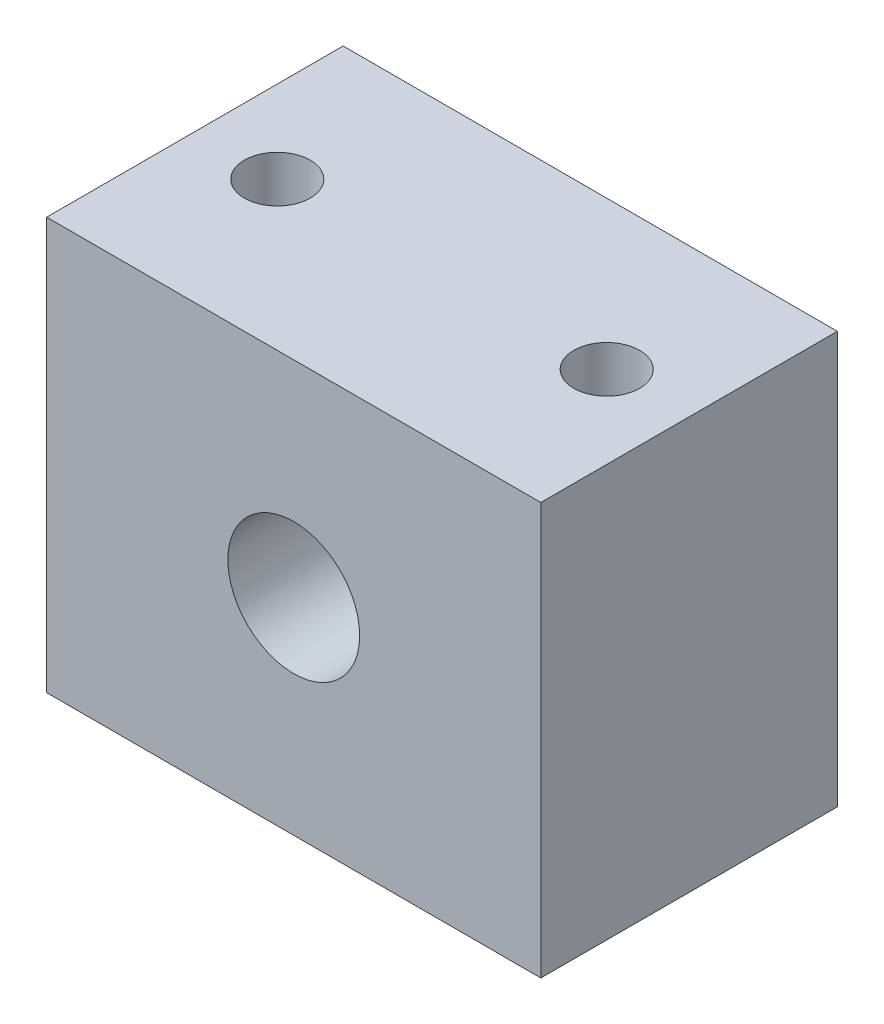
ISO-10303-21;
HEADER;
FILE_DESCRIPTION(('STEP AP214'),'2;1');
FILE_NAME('part.step','',(''),(''),'','','');
FILE_SCHEMA(('AUTOMOTIVE_DESIGN { 1 0 10303 214 1 1 1 1 }'));
ENDSEC;
DATA;
#1=APPLICATION_CONTEXT('core data for automotive mechanical design processes');
#2=APPLICATION_PROTOCOL_DEFINITION('international standard','automotive_design',2000,#1);
#3=PRODUCT_CONTEXT('',#1,'mechanical');
#4=PRODUCT('Part','Part','',(#3));
#5=PRODUCT_RELATED_PRODUCT_CATEGORY('part','',(#4));
#6=PRODUCT_DEFINITION_FORMATION('','',#4);
#7=PRODUCT_DEFINITION_CONTEXT('part definition',#1,'design');
#8=PRODUCT_DEFINITION('design','',#6,#7);
#9=PRODUCT_DEFINITION_SHAPE('','',#8);
#10=(LENGTH_UNIT() NAMED_UNIT(*) SI_UNIT(.MILLI.,.METRE.));
#11=(NAMED_UNIT(*) PLANE_ANGLE_UNIT() SI_UNIT($,.RADIAN.));
#12=(NAMED_UNIT(*) SI_UNIT($,.STERADIAN.) SOLID_ANGLE_UNIT());
#13=UNCERTAINTY_MEASURE_WITH_UNIT(LENGTH_MEASURE(1.E-05),#10,'distance_accuracy_value','');
#14=(GEOMETRIC_REPRESENTATION_CONTEXT(3) GLOBAL_UNCERTAINTY_ASSIGNED_CONTEXT((#13)) GLOBAL_UNIT_ASSIGNED_CONTEXT((#10,
#11,#12)) REPRESENTATION_CONTEXT('',''));
#15=CARTESIAN_POINT('',(0.,0.,0.));
#16=DIRECTION('',(0.,0.,1.));
#17=DIRECTION('',(1.,0.,0.));
#18=AXIS2_PLACEMENT_3D('',#15,#16,#17);
#19=CARTESIAN_POINT('',(0.,0.,18.));
#20=DIRECTION('',(0.,0.,1.));
#21=DIRECTION('',(1.,0.,0.));
#22=AXIS2_PLACEMENT_3D('',#19,#20,#21);
#23=PLANE('',#22);
#24=DIRECTION('',(0.,1.,0.));
#25=VECTOR('',#24,1.);
#26=CARTESIAN_POINT('',(15.,12.5,18.));
#27=LINE('',#26,#25);
#28=CARTESIAN_POINT('',(15.,-12.5,18.));
#29=VERTEX_POINT('',#28);
#30=CARTESIAN_POINT('',(15.,12.5,18.));
#31=VERTEX_POINT('',#30);
#32=EDGE_CURVE('E85',#29,#31,#27,.T.);
#33=ORIENTED_EDGE('',*,*,#32,.T.);
#34=DIRECTION('',(-1.,0.,0.));
#35=VECTOR('',#34,1.);
#36=CARTESIAN_POINT('',(-15.,12.5,18.));
#37=LINE('',#36,#35);
#38=CARTESIAN_POINT('',(-15.,12.5,18.));
#39=VERTEX_POINT('',#38);
#40=EDGE_CURVE('E80',#31,#39,#37,.T.);
#41=ORIENTED_EDGE('',*,*,#40,.T.);
#42=DIRECTION('',(0.,-1.,0.));
#43=VECTOR('',#42,1.);
#44=CARTESIAN_POINT('',(-15.,12.5,18.));
#45=LINE('',#44,#43);
#46=CARTESIAN_POINT('',(-15.,-12.5,18.));
#47=VERTEX_POINT('',#46);
#48=EDGE_CURVE('E83',#39,#47,#45,.T.);
#49=ORIENTED_EDGE('',*,*,#48,.T.);
#50=DIRECTION('',(1.,0.,0.));
#51=VECTOR('',#50,1.);
#52=CARTESIAN_POINT('',(-15.,-12.5,18.));
#53=LINE('',#52,#51);
#54=EDGE_CURVE('E50',#47,#29,#53,.T.);
#55=ORIENTED_EDGE('',*,*,#54,.T.);
#56=EDGE_LOOP('',(#33,#41,#49,#55));
#57=FACE_BOUND('',#56,.T.);
#58=CARTESIAN_POINT('',(0.,0.,18.));
#59=DIRECTION('',(0.,0.,1.));
#60=DIRECTION('',(1.,0.,0.));
#61=AXIS2_PLACEMENT_3D('',#58,#59,#60);
#62=CIRCLE('',#61,4.);
#63=CARTESIAN_POINT('',(4.,0.,18.));
#64=VERTEX_POINT('',#63);
#65=EDGE_CURVE('E100',#64,#64,#62,.T.);
#66=ORIENTED_EDGE('',*,*,#65,.F.);
#67=EDGE_LOOP('',(#66));
#68=FACE_BOUND('',#67,.T.);
#69=ADVANCED_FACE('F33',(#57,#68),#23,.T.);
#70=CARTESIAN_POINT('',(0.,0.,0.));
#71=DIRECTION('',(0.,0.,1.));
#72=DIRECTION('',(1.,0.,0.));
#73=AXIS2_PLACEMENT_3D('',#70,#71,#72);
#74=PLANE('',#73);
#75=DIRECTION('',(0.,1.,0.));
#76=VECTOR('',#75,1.);
#77=CARTESIAN_POINT('',(15.,12.5,0.));
#78=LINE('',#77,#76);
#79=CARTESIAN_POINT('',(15.,-12.5,0.));
#80=VERTEX_POINT('',#79);
#81=CARTESIAN_POINT('',(15.,12.5,0.));
#82=VERTEX_POINT('',#81);
#83=EDGE_CURVE('E97',#80,#82,#78,.T.);
#84=ORIENTED_EDGE('',*,*,#83,.F.);
#85=DIRECTION('',(1.,0.,0.));
#86=VECTOR('',#85,1.);
#87=CARTESIAN_POINT('',(-15.,-12.5,0.));
#88=LINE('',#87,#86);
#89=CARTESIAN_POINT('',(-15.,-12.5,0.));
#90=VERTEX_POINT('',#89);
#91=EDGE_CURVE('E73',#90,#80,#88,.T.);
#92=ORIENTED_EDGE('',*,*,#91,.F.);
#93=DIRECTION('',(0.,-1.,0.));
#94=VECTOR('',#93,1.);
#95=CARTESIAN_POINT('',(-15.,12.5,0.));
#96=LINE('',#95,#94);
#97=CARTESIAN_POINT('',(-15.,12.5,0.));
#98=VERTEX_POINT('',#97);
#99=EDGE_CURVE('E67',#98,#90,#96,.T.);
#100=ORIENTED_EDGE('',*,*,#99,.F.);
#101=DIRECTION('',(-1.,0.,0.));
#102=VECTOR('',#101,1.);
#103=CARTESIAN_POINT('',(-15.,12.5,0.));
#104=LINE('',#103,#102);
#105=EDGE_CURVE('E89',#82,#98,#104,.T.);
#106=ORIENTED_EDGE('',*,*,#105,.F.);
#107=EDGE_LOOP('',(#84,#92,#100,#106));
#108=FACE_BOUND('',#107,.T.);
#109=CARTESIAN_POINT('',(0.,0.,0.));
#110=DIRECTION('',(0.,0.,1.));
#111=DIRECTION('',(1.,0.,0.));
#112=AXIS2_PLACEMENT_3D('',#109,#110,#111);
#113=CIRCLE('',#112,4.);
#114=CARTESIAN_POINT('',(4.,0.,0.));
#115=VERTEX_POINT('',#114);
#116=EDGE_CURVE('E112',#115,#115,#113,.T.);
#117=ORIENTED_EDGE('',*,*,#116,.T.);
#118=EDGE_LOOP('',(#117));
#119=FACE_BOUND('',#118,.T.);
#120=ADVANCED_FACE('F108',(#108,#119),#74,.F.);
#121=CARTESIAN_POINT('',(15.,12.5,18.));
#122=DIRECTION('',(-1.,0.,0.));
#123=DIRECTION('',(0.,-1.,0.));
#124=AXIS2_PLACEMENT_3D('',#121,#122,#123);
#125=PLANE('',#124);
#126=ORIENTED_EDGE('',*,*,#83,.T.);
#127=DIRECTION('',(0.,0.,-1.));
#128=VECTOR('',#127,1.);
#129=CARTESIAN_POINT('',(15.,12.5,18.));
#130=LINE('',#129,#128);
#131=EDGE_CURVE('E11',#31,#82,#130,.T.);
#132=ORIENTED_EDGE('',*,*,#131,.F.);
#133=ORIENTED_EDGE('',*,*,#32,.F.);
#134=DIRECTION('',(0.,0.,-1.));
#135=VECTOR('',#134,1.);
#136=CARTESIAN_POINT('',(15.,-12.5,18.));
#137=LINE('',#136,#135);
#138=EDGE_CURVE('E93',#29,#80,#137,.T.);
#139=ORIENTED_EDGE('',*,*,#138,.T.);
#140=EDGE_LOOP('',(#126,#132,#133,#139));
#141=FACE_BOUND('',#140,.T.);
#142=ADVANCED_FACE('F35',(#141),#125,.F.);
#143=CARTESIAN_POINT('',(-15.,12.5,18.));
#144=DIRECTION('',(0.,-1.,0.));
#145=DIRECTION('',(0.,0.,-1.));
#146=AXIS2_PLACEMENT_3D('',#143,#144,#145);
#147=PLANE('',#146);
#148=CARTESIAN_POINT('',(-10.,12.5,9.));
#149=DIRECTION('',(0.,1.,0.));
#150=DIRECTION('',(0.,0.,1.));
#151=AXIS2_PLACEMENT_3D('',#148,#149,#150);
#152=CIRCLE('',#151,2.);
#153=CARTESIAN_POINT('',(-10.,12.5,11.));
#154=VERTEX_POINT('',#153);
#155=EDGE_CURVE('E124',#154,#154,#152,.T.);
#156=ORIENTED_EDGE('',*,*,#155,.F.);
#157=EDGE_LOOP('',(#156));
#158=FACE_BOUND('',#157,.T.);
#159=CARTESIAN_POINT('',(10.,12.5,9.));
#160=DIRECTION('',(0.,1.,0.));
#161=DIRECTION('',(0.,0.,-1.));
#162=AXIS2_PLACEMENT_3D('',#159,#160,#161);
#163=CIRCLE('',#162,2.);
#164=CARTESIAN_POINT('',(10.,12.5,7.));
#165=VERTEX_POINT('',#164);
#166=EDGE_CURVE('E118',#165,#165,#163,.T.);
#167=ORIENTED_EDGE('',*,*,#166,.F.);
#168=EDGE_LOOP('',(#167));
#169=FACE_BOUND('',#168,.T.);
#170=ORIENTED_EDGE('',*,*,#105,.T.);
#171=DIRECTION('',(0.,0.,-1.));
#172=VECTOR('',#171,1.);
#173=CARTESIAN_POINT('',(-15.,12.5,18.));
#174=LINE('',#173,#172);
#175=EDGE_CURVE('E42',#39,#98,#174,.T.);
#176=ORIENTED_EDGE('',*,*,#175,.F.);
#177=ORIENTED_EDGE('',*,*,#40,.F.);
#178=ORIENTED_EDGE('',*,*,#131,.T.);
#179=EDGE_LOOP('',(#170,#176,#177,#178));
#180=FACE_BOUND('',#179,.T.);
#181=ADVANCED_FACE('F88',(#158,#169,#180),#147,.F.);
#182=CARTESIAN_POINT('',(-15.,12.5,18.));
#183=DIRECTION('',(1.,0.,0.));
#184=DIRECTION('',(0.,1.,0.));
#185=AXIS2_PLACEMENT_3D('',#182,#183,#184);
#186=PLANE('',#185);
#187=ORIENTED_EDGE('',*,*,#99,.T.);
#188=DIRECTION('',(0.,0.,-1.));
#189=VECTOR('',#188,1.);
#190=CARTESIAN_POINT('',(-15.,-12.5,18.));
#191=LINE('',#190,#189);
#192=EDGE_CURVE('E90',#47,#90,#191,.T.);
#193=ORIENTED_EDGE('',*,*,#192,.F.);
#194=ORIENTED_EDGE('',*,*,#48,.F.);
#195=ORIENTED_EDGE('',*,*,#175,.T.);
#196=EDGE_LOOP('',(#187,#193,#194,#195));
#197=FACE_BOUND('',#196,.T.);
#198=ADVANCED_FACE('F91',(#197),#186,.F.);
#199=CARTESIAN_POINT('',(-15.,-12.5,18.));
#200=DIRECTION('',(0.,1.,0.));
#201=DIRECTION('',(0.,0.,1.));
#202=AXIS2_PLACEMENT_3D('',#199,#200,#201);
#203=PLANE('',#202);
#204=CARTESIAN_POINT('',(-10.,-12.5,9.));
#205=DIRECTION('',(0.,1.,0.));
#206=DIRECTION('',(0.,0.,1.));
#207=AXIS2_PLACEMENT_3D('',#204,#205,#206);
#208=CIRCLE('',#207,2.);
#209=CARTESIAN_POINT('',(-10.,-12.5,11.));
#210=VERTEX_POINT('',#209);
#211=EDGE_CURVE('E115',#210,#210,#208,.T.);
#212=ORIENTED_EDGE('',*,*,#211,.T.);
#213=EDGE_LOOP('',(#212));
#214=FACE_BOUND('',#213,.T.);
#215=CARTESIAN_POINT('',(10.,-12.5,9.));
#216=DIRECTION('',(0.,1.,0.));
#217=DIRECTION('',(0.,0.,-1.));
#218=AXIS2_PLACEMENT_3D('',#215,#216,#217);
#219=CIRCLE('',#218,2.);
#220=CARTESIAN_POINT('',(10.,-12.5,7.));
#221=VERTEX_POINT('',#220);
#222=EDGE_CURVE('E121',#221,#221,#219,.T.);
#223=ORIENTED_EDGE('',*,*,#222,.T.);
#224=EDGE_LOOP('',(#223));
#225=FACE_BOUND('',#224,.T.);
#226=ORIENTED_EDGE('',*,*,#91,.T.);
#227=ORIENTED_EDGE('',*,*,#138,.F.);
#228=ORIENTED_EDGE('',*,*,#54,.F.);
#229=ORIENTED_EDGE('',*,*,#192,.T.);
#230=EDGE_LOOP('',(#226,#227,#228,#229));
#231=FACE_BOUND('',#230,.T.);
#232=ADVANCED_FACE('F105',(#214,#225,#231),#203,.F.);
#233=CARTESIAN_POINT('',(0.,0.,18.));
#234=DIRECTION('',(0.,0.,-1.));
#235=DIRECTION('',(-1.,0.,0.));
#236=AXIS2_PLACEMENT_3D('',#233,#234,#235);
#237=CYLINDRICAL_SURFACE('',#236,4.);
#238=ORIENTED_EDGE('',*,*,#65,.T.);
#239=EDGE_LOOP('',(#238));
#240=FACE_BOUND('',#239,.T.);
#241=ORIENTED_EDGE('',*,*,#116,.F.);
#242=EDGE_LOOP('',(#241));
#243=FACE_BOUND('',#242,.T.);
#244=ADVANCED_FACE('F144',(#240,#243),#237,.F.);
#245=CARTESIAN_POINT('',(10.,-12.5,9.));
#246=DIRECTION('',(0.,1.,0.));
#247=DIRECTION('',(0.,0.,1.));
#248=AXIS2_PLACEMENT_3D('',#245,#246,#247);
#249=CYLINDRICAL_SURFACE('',#248,2.);
#250=ORIENTED_EDGE('',*,*,#222,.F.);
#251=EDGE_LOOP('',(#250));
#252=FACE_BOUND('',#251,.T.);
#253=ORIENTED_EDGE('',*,*,#166,.T.);
#254=EDGE_LOOP('',(#253));
#255=FACE_BOUND('',#254,.T.);
#256=ADVANCED_FACE('F135',(#252,#255),#249,.F.);
#257=CARTESIAN_POINT('',(-10.,-12.5,9.));
#258=DIRECTION('',(0.,1.,0.));
#259=DIRECTION('',(0.,0.,1.));
#260=AXIS2_PLACEMENT_3D('',#257,#258,#259);
#261=CYLINDRICAL_SURFACE('',#260,2.);
#262=ORIENTED_EDGE('',*,*,#211,.F.);
#263=EDGE_LOOP('',(#262));
#264=FACE_BOUND('',#263,.T.);
#265=ORIENTED_EDGE('',*,*,#155,.T.);
#266=EDGE_LOOP('',(#265));
#267=FACE_BOUND('',#266,.T.);
#268=ADVANCED_FACE('F132',(#264,#267),#261,.F.);
#269=CLOSED_SHELL('',(#69,#120,#142,#181,#198,#232,#244,#256,#268));
#270=MANIFOLD_SOLID_BREP('B2',#269);
#271=ADVANCED_BREP_SHAPE_REPRESENTATION('',(#18,#270),#14);
#272=SHAPE_DEFINITION_REPRESENTATION(#9,#271);
ENDSEC;
END-ISO-10303-21;
